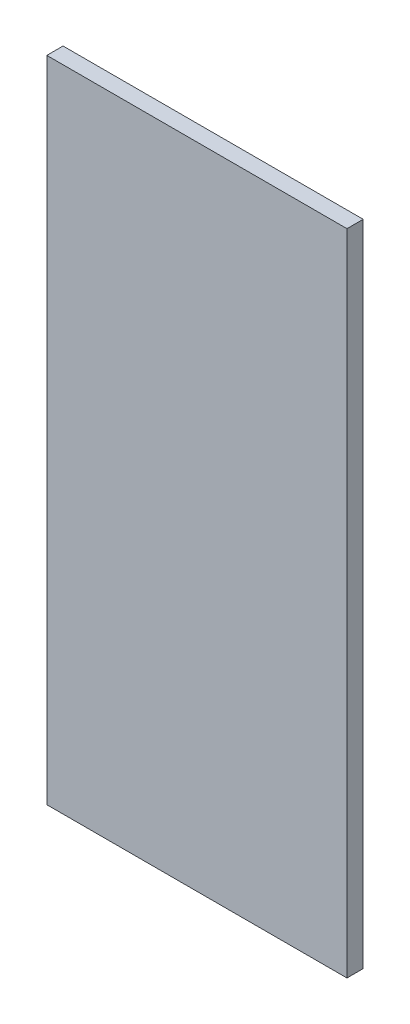
ISO-10303-21;
HEADER;
FILE_DESCRIPTION(('STEP AP214'),'2;1');
FILE_NAME('part.step','',(''),(''),'','','');
FILE_SCHEMA(('AUTOMOTIVE_DESIGN { 1 0 10303 214 1 1 1 1 }'));
ENDSEC;
DATA;
#1=APPLICATION_CONTEXT('core data for automotive mechanical design processes');
#2=APPLICATION_PROTOCOL_DEFINITION('international standard','automotive_design',2000,#1);
#3=PRODUCT_CONTEXT('',#1,'mechanical');
#4=PRODUCT('Part','Part','',(#3));
#5=PRODUCT_RELATED_PRODUCT_CATEGORY('part','',(#4));
#6=PRODUCT_DEFINITION_FORMATION('','',#4);
#7=PRODUCT_DEFINITION_CONTEXT('part definition',#1,'design');
#8=PRODUCT_DEFINITION('design','',#6,#7);
#9=PRODUCT_DEFINITION_SHAPE('','',#8);
#10=(LENGTH_UNIT() NAMED_UNIT(*) SI_UNIT(.MILLI.,.METRE.));
#11=(NAMED_UNIT(*) PLANE_ANGLE_UNIT() SI_UNIT($,.RADIAN.));
#12=(NAMED_UNIT(*) SI_UNIT($,.STERADIAN.) SOLID_ANGLE_UNIT());
#13=UNCERTAINTY_MEASURE_WITH_UNIT(LENGTH_MEASURE(1.E-05),#10,'distance_accuracy_value','');
#14=(GEOMETRIC_REPRESENTATION_CONTEXT(3) GLOBAL_UNCERTAINTY_ASSIGNED_CONTEXT((#13)) GLOBAL_UNIT_ASSIGNED_CONTEXT((#10,
#11,#12)) REPRESENTATION_CONTEXT('',''));
#15=CARTESIAN_POINT('',(0.,0.,0.));
#16=DIRECTION('',(0.,0.,1.));
#17=DIRECTION('',(1.,0.,0.));
#18=AXIS2_PLACEMENT_3D('',#15,#16,#17);
#19=CARTESIAN_POINT('',(0.,0.,2.));
#20=DIRECTION('',(1.,0.,0.));
#21=DIRECTION('',(0.,0.,-1.));
#22=AXIS2_PLACEMENT_3D('',#19,#20,#21);
#23=PLANE('',#22);
#24=DIRECTION('',(0.,-1.,0.));
#25=VECTOR('',#24,1.);
#26=CARTESIAN_POINT('',(0.,0.,0.));
#27=LINE('',#26,#25);
#28=CARTESIAN_POINT('',(0.,80.,0.));
#29=VERTEX_POINT('',#28);
#30=CARTESIAN_POINT('',(0.,0.,0.));
#31=VERTEX_POINT('',#30);
#32=EDGE_CURVE('E107',#29,#31,#27,.T.);
#33=ORIENTED_EDGE('',*,*,#32,.T.);
#34=DIRECTION('',(0.,0.,-1.));
#35=VECTOR('',#34,1.);
#36=CARTESIAN_POINT('',(0.,0.,2.));
#37=LINE('',#36,#35);
#38=CARTESIAN_POINT('',(0.,0.,2.));
#39=VERTEX_POINT('',#38);
#40=EDGE_CURVE('E11',#39,#31,#37,.T.);
#41=ORIENTED_EDGE('',*,*,#40,.F.);
#42=DIRECTION('',(0.,-1.,0.));
#43=VECTOR('',#42,1.);
#44=CARTESIAN_POINT('',(0.,0.,2.));
#45=LINE('',#44,#43);
#46=CARTESIAN_POINT('',(0.,80.,2.));
#47=VERTEX_POINT('',#46);
#48=EDGE_CURVE('E91',#47,#39,#45,.T.);
#49=ORIENTED_EDGE('',*,*,#48,.F.);
#50=DIRECTION('',(0.,0.,-1.));
#51=VECTOR('',#50,1.);
#52=CARTESIAN_POINT('',(0.,80.,2.));
#53=LINE('',#52,#51);
#54=EDGE_CURVE('E103',#47,#29,#53,.T.);
#55=ORIENTED_EDGE('',*,*,#54,.T.);
#56=EDGE_LOOP('',(#33,#41,#49,#55));
#57=FACE_BOUND('',#56,.T.);
#58=ADVANCED_FACE('F39',(#57),#23,.F.);
#59=CARTESIAN_POINT('',(0.,0.,2.));
#60=DIRECTION('',(0.,1.,0.));
#61=DIRECTION('',(0.,0.,1.));
#62=AXIS2_PLACEMENT_3D('',#59,#60,#61);
#63=PLANE('',#62);
#64=DIRECTION('',(1.,0.,0.));
#65=VECTOR('',#64,1.);
#66=CARTESIAN_POINT('',(0.,0.,0.));
#67=LINE('',#66,#65);
#68=CARTESIAN_POINT('',(37.,0.,0.));
#69=VERTEX_POINT('',#68);
#70=EDGE_CURVE('E96',#31,#69,#67,.T.);
#71=ORIENTED_EDGE('',*,*,#70,.T.);
#72=DIRECTION('',(0.,0.,-1.));
#73=VECTOR('',#72,1.);
#74=CARTESIAN_POINT('',(37.,0.,2.));
#75=LINE('',#74,#73);
#76=CARTESIAN_POINT('',(37.,0.,2.));
#77=VERTEX_POINT('',#76);
#78=EDGE_CURVE('E48',#77,#69,#75,.T.);
#79=ORIENTED_EDGE('',*,*,#78,.F.);
#80=DIRECTION('',(1.,0.,0.));
#81=VECTOR('',#80,1.);
#82=CARTESIAN_POINT('',(0.,0.,2.));
#83=LINE('',#82,#81);
#84=EDGE_CURVE('E86',#39,#77,#83,.T.);
#85=ORIENTED_EDGE('',*,*,#84,.F.);
#86=ORIENTED_EDGE('',*,*,#40,.T.);
#87=EDGE_LOOP('',(#71,#79,#85,#86));
#88=FACE_BOUND('',#87,.T.);
#89=ADVANCED_FACE('F95',(#88),#63,.F.);
#90=CARTESIAN_POINT('',(37.,0.,2.));
#91=DIRECTION('',(-1.,0.,0.));
#92=DIRECTION('',(0.,0.,1.));
#93=AXIS2_PLACEMENT_3D('',#90,#91,#92);
#94=PLANE('',#93);
#95=DIRECTION('',(0.,1.,0.));
#96=VECTOR('',#95,1.);
#97=CARTESIAN_POINT('',(37.,0.,0.));
#98=LINE('',#97,#96);
#99=CARTESIAN_POINT('',(37.,80.,0.));
#100=VERTEX_POINT('',#99);
#101=EDGE_CURVE('E73',#69,#100,#98,.T.);
#102=ORIENTED_EDGE('',*,*,#101,.T.);
#103=DIRECTION('',(0.,0.,-1.));
#104=VECTOR('',#103,1.);
#105=CARTESIAN_POINT('',(37.,80.,2.));
#106=LINE('',#105,#104);
#107=CARTESIAN_POINT('',(37.,80.,2.));
#108=VERTEX_POINT('',#107);
#109=EDGE_CURVE('E98',#108,#100,#106,.T.);
#110=ORIENTED_EDGE('',*,*,#109,.F.);
#111=DIRECTION('',(0.,1.,0.));
#112=VECTOR('',#111,1.);
#113=CARTESIAN_POINT('',(37.,0.,2.));
#114=LINE('',#113,#112);
#115=EDGE_CURVE('E89',#77,#108,#114,.T.);
#116=ORIENTED_EDGE('',*,*,#115,.F.);
#117=ORIENTED_EDGE('',*,*,#78,.T.);
#118=EDGE_LOOP('',(#102,#110,#116,#117));
#119=FACE_BOUND('',#118,.T.);
#120=ADVANCED_FACE('F99',(#119),#94,.F.);
#121=CARTESIAN_POINT('',(0.,80.,2.));
#122=DIRECTION('',(0.,-1.,0.));
#123=DIRECTION('',(0.,0.,-1.));
#124=AXIS2_PLACEMENT_3D('',#121,#122,#123);
#125=PLANE('',#124);
#126=DIRECTION('',(-1.,0.,0.));
#127=VECTOR('',#126,1.);
#128=CARTESIAN_POINT('',(0.,80.,0.));
#129=LINE('',#128,#127);
#130=EDGE_CURVE('E79',#100,#29,#129,.T.);
#131=ORIENTED_EDGE('',*,*,#130,.T.);
#132=ORIENTED_EDGE('',*,*,#54,.F.);
#133=DIRECTION('',(-1.,0.,0.));
#134=VECTOR('',#133,1.);
#135=CARTESIAN_POINT('',(0.,80.,2.));
#136=LINE('',#135,#134);
#137=EDGE_CURVE('E56',#108,#47,#136,.T.);
#138=ORIENTED_EDGE('',*,*,#137,.F.);
#139=ORIENTED_EDGE('',*,*,#109,.T.);
#140=EDGE_LOOP('',(#131,#132,#138,#139));
#141=FACE_BOUND('',#140,.T.);
#142=ADVANCED_FACE('F120',(#141),#125,.F.);
#143=CARTESIAN_POINT('',(0.,0.,2.));
#144=DIRECTION('',(0.,0.,-1.));
#145=DIRECTION('',(-1.,0.,0.));
#146=AXIS2_PLACEMENT_3D('',#143,#144,#145);
#147=PLANE('',#146);
#148=ORIENTED_EDGE('',*,*,#48,.T.);
#149=ORIENTED_EDGE('',*,*,#84,.T.);
#150=ORIENTED_EDGE('',*,*,#115,.T.);
#151=ORIENTED_EDGE('',*,*,#137,.T.);
#152=EDGE_LOOP('',(#148,#149,#150,#151));
#153=FACE_BOUND('',#152,.T.);
#154=ADVANCED_FACE('F87',(#153),#147,.F.);
#155=CARTESIAN_POINT('',(0.,0.,0.));
#156=DIRECTION('',(0.,0.,-1.));
#157=DIRECTION('',(-1.,0.,0.));
#158=AXIS2_PLACEMENT_3D('',#155,#156,#157);
#159=PLANE('',#158);
#160=ORIENTED_EDGE('',*,*,#32,.F.);
#161=ORIENTED_EDGE('',*,*,#130,.F.);
#162=ORIENTED_EDGE('',*,*,#101,.F.);
#163=ORIENTED_EDGE('',*,*,#70,.F.);
#164=EDGE_LOOP('',(#160,#161,#162,#163));
#165=FACE_BOUND('',#164,.T.);
#166=ADVANCED_FACE('F123',(#165),#159,.T.);
#167=CLOSED_SHELL('',(#58,#89,#120,#142,#154,#166));
#168=MANIFOLD_SOLID_BREP('B2',#167);
#169=ADVANCED_BREP_SHAPE_REPRESENTATION('',(#18,#168),#14);
#170=SHAPE_DEFINITION_REPRESENTATION(#9,#169);
ENDSEC;
END-ISO-10303-21;
